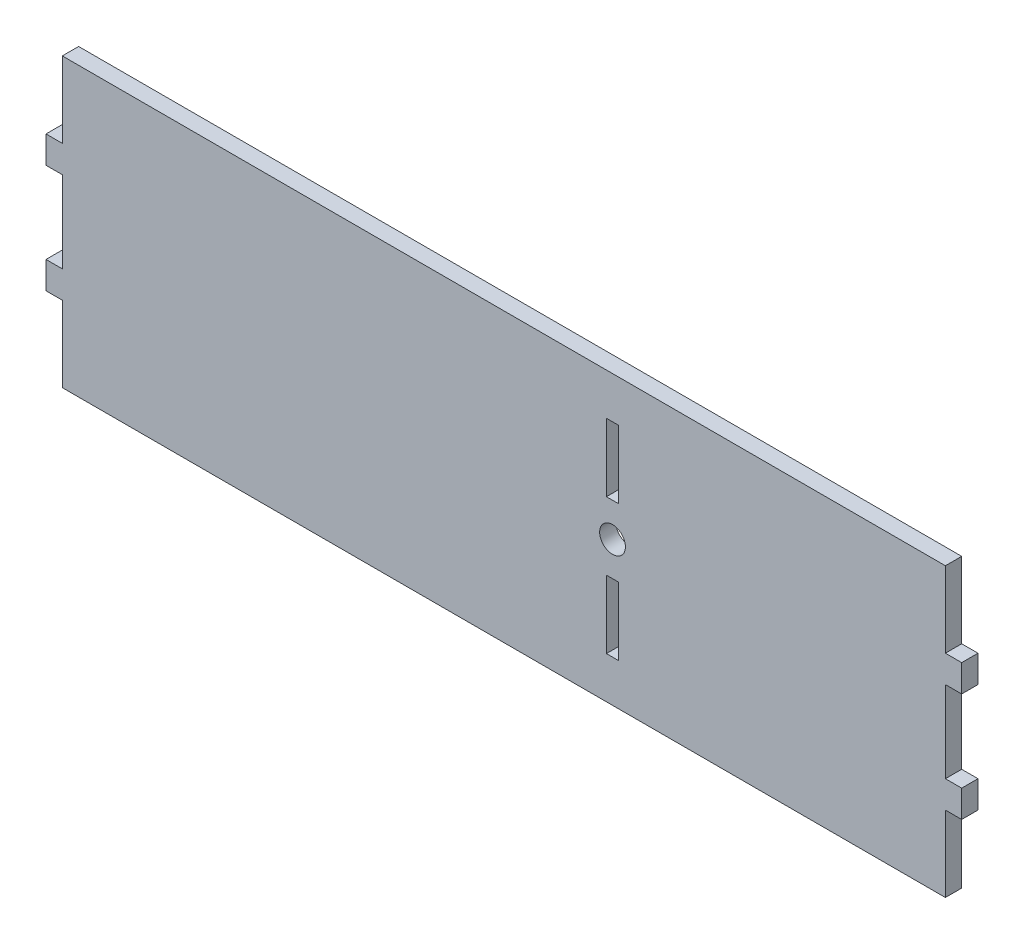
ISO-10303-21;
HEADER;
FILE_DESCRIPTION(('STEP AP214'),'2;1');
FILE_NAME('part.step','',(''),(''),'','','');
FILE_SCHEMA(('AUTOMOTIVE_DESIGN { 1 0 10303 214 1 1 1 1 }'));
ENDSEC;
DATA;
#1=APPLICATION_CONTEXT('core data for automotive mechanical design processes');
#2=APPLICATION_PROTOCOL_DEFINITION('international standard','automotive_design',2000,#1);
#3=PRODUCT_CONTEXT('',#1,'mechanical');
#4=PRODUCT('Part','Part','',(#3));
#5=PRODUCT_RELATED_PRODUCT_CATEGORY('part','',(#4));
#6=PRODUCT_DEFINITION_FORMATION('','',#4);
#7=PRODUCT_DEFINITION_CONTEXT('part definition',#1,'design');
#8=PRODUCT_DEFINITION('design','',#6,#7);
#9=PRODUCT_DEFINITION_SHAPE('','',#8);
#10=(LENGTH_UNIT() NAMED_UNIT(*) SI_UNIT(.MILLI.,.METRE.));
#11=(NAMED_UNIT(*) PLANE_ANGLE_UNIT() SI_UNIT($,.RADIAN.));
#12=(NAMED_UNIT(*) SI_UNIT($,.STERADIAN.) SOLID_ANGLE_UNIT());
#13=UNCERTAINTY_MEASURE_WITH_UNIT(LENGTH_MEASURE(1.E-05),#10,'distance_accuracy_value','');
#14=(GEOMETRIC_REPRESENTATION_CONTEXT(3) GLOBAL_UNCERTAINTY_ASSIGNED_CONTEXT((#13)) GLOBAL_UNIT_ASSIGNED_CONTEXT((#10,
#11,#12)) REPRESENTATION_CONTEXT('',''));
#15=CARTESIAN_POINT('',(0.,0.,0.));
#16=DIRECTION('',(0.,0.,1.));
#17=DIRECTION('',(1.,0.,0.));
#18=AXIS2_PLACEMENT_3D('',#15,#16,#17);
#19=CARTESIAN_POINT('',(0.,-15.,2.4));
#20=DIRECTION('',(0.,-1.,0.));
#21=DIRECTION('',(0.,0.,-1.));
#22=AXIS2_PLACEMENT_3D('',#19,#20,#21);
#23=PLANE('',#22);
#24=DIRECTION('',(-1.,0.,0.));
#25=VECTOR('',#24,1.);
#26=CARTESIAN_POINT('',(0.,-15.,0.));
#27=LINE('',#26,#25);
#28=CARTESIAN_POINT('',(16.9,-15.,0.));
#29=VERTEX_POINT('',#28);
#30=CARTESIAN_POINT('',(15.1,-15.,0.));
#31=VERTEX_POINT('',#30);
#32=EDGE_CURVE('E315',#29,#31,#27,.T.);
#33=ORIENTED_EDGE('',*,*,#32,.T.);
#34=DIRECTION('',(0.,0.,-1.));
#35=VECTOR('',#34,1.);
#36=CARTESIAN_POINT('',(15.1,-15.,2.4));
#37=LINE('',#36,#35);
#38=CARTESIAN_POINT('',(15.1,-15.,2.4));
#39=VERTEX_POINT('',#38);
#40=EDGE_CURVE('E11',#39,#31,#37,.T.);
#41=ORIENTED_EDGE('',*,*,#40,.F.);
#42=DIRECTION('',(-1.,0.,0.));
#43=VECTOR('',#42,1.);
#44=CARTESIAN_POINT('',(0.,-15.,2.4));
#45=LINE('',#44,#43);
#46=CARTESIAN_POINT('',(16.9,-15.,2.4));
#47=VERTEX_POINT('',#46);
#48=EDGE_CURVE('E234',#47,#39,#45,.T.);
#49=ORIENTED_EDGE('',*,*,#48,.F.);
#50=DIRECTION('',(0.,0.,-1.));
#51=VECTOR('',#50,1.);
#52=CARTESIAN_POINT('',(16.9,-15.,2.4));
#53=LINE('',#52,#51);
#54=EDGE_CURVE('E54',#47,#29,#53,.T.);
#55=ORIENTED_EDGE('',*,*,#54,.T.);
#56=EDGE_LOOP('',(#33,#41,#49,#55));
#57=FACE_BOUND('',#56,.T.);
#58=ADVANCED_FACE('F35',(#57),#23,.F.);
#59=CARTESIAN_POINT('',(15.1,0.,2.4));
#60=DIRECTION('',(-1.,0.,0.));
#61=DIRECTION('',(0.,-1.,0.));
#62=AXIS2_PLACEMENT_3D('',#59,#60,#61);
#63=PLANE('',#62);
#64=DIRECTION('',(0.,1.,0.));
#65=VECTOR('',#64,1.);
#66=CARTESIAN_POINT('',(15.1,0.,0.));
#67=LINE('',#66,#65);
#68=CARTESIAN_POINT('',(15.1,-5.,0.));
#69=VERTEX_POINT('',#68);
#70=EDGE_CURVE('E240',#31,#69,#67,.T.);
#71=ORIENTED_EDGE('',*,*,#70,.T.);
#72=DIRECTION('',(0.,0.,-1.));
#73=VECTOR('',#72,1.);
#74=CARTESIAN_POINT('',(15.1,-5.,2.4));
#75=LINE('',#74,#73);
#76=CARTESIAN_POINT('',(15.1,-5.,2.4));
#77=VERTEX_POINT('',#76);
#78=EDGE_CURVE('E45',#77,#69,#75,.T.);
#79=ORIENTED_EDGE('',*,*,#78,.F.);
#80=DIRECTION('',(0.,1.,0.));
#81=VECTOR('',#80,1.);
#82=CARTESIAN_POINT('',(15.1,0.,2.4));
#83=LINE('',#82,#81);
#84=EDGE_CURVE('E228',#39,#77,#83,.T.);
#85=ORIENTED_EDGE('',*,*,#84,.F.);
#86=ORIENTED_EDGE('',*,*,#40,.T.);
#87=EDGE_LOOP('',(#71,#79,#85,#86));
#88=FACE_BOUND('',#87,.T.);
#89=ADVANCED_FACE('F239',(#88),#63,.F.);
#90=CARTESIAN_POINT('',(0.,-5.,2.4));
#91=DIRECTION('',(0.,-1.,0.));
#92=DIRECTION('',(0.,0.,-1.));
#93=AXIS2_PLACEMENT_3D('',#90,#91,#92);
#94=PLANE('',#93);
#95=DIRECTION('',(-1.,0.,0.));
#96=VECTOR('',#95,1.);
#97=CARTESIAN_POINT('',(0.,-5.,0.));
#98=LINE('',#97,#96);
#99=CARTESIAN_POINT('',(16.9,-5.,0.));
#100=VERTEX_POINT('',#99);
#101=EDGE_CURVE('E318',#100,#69,#98,.T.);
#102=ORIENTED_EDGE('',*,*,#101,.F.);
#103=DIRECTION('',(0.,0.,-1.));
#104=VECTOR('',#103,1.);
#105=CARTESIAN_POINT('',(16.9,-5.,2.4));
#106=LINE('',#105,#104);
#107=CARTESIAN_POINT('',(16.9,-5.,2.4));
#108=VERTEX_POINT('',#107);
#109=EDGE_CURVE('E140',#108,#100,#106,.T.);
#110=ORIENTED_EDGE('',*,*,#109,.F.);
#111=DIRECTION('',(-1.,0.,0.));
#112=VECTOR('',#111,1.);
#113=CARTESIAN_POINT('',(0.,-5.,2.4));
#114=LINE('',#113,#112);
#115=EDGE_CURVE('E233',#108,#77,#114,.T.);
#116=ORIENTED_EDGE('',*,*,#115,.T.);
#117=ORIENTED_EDGE('',*,*,#78,.T.);
#118=EDGE_LOOP('',(#102,#110,#116,#117));
#119=FACE_BOUND('',#118,.T.);
#120=ADVANCED_FACE('F244',(#119),#94,.T.);
#121=CARTESIAN_POINT('',(16.9,0.,2.4));
#122=DIRECTION('',(1.,0.,0.));
#123=DIRECTION('',(0.,0.,-1.));
#124=AXIS2_PLACEMENT_3D('',#121,#122,#123);
#125=PLANE('',#124);
#126=DIRECTION('',(0.,-1.,0.));
#127=VECTOR('',#126,1.);
#128=CARTESIAN_POINT('',(16.9,0.,0.));
#129=LINE('',#128,#127);
#130=CARTESIAN_POINT('',(16.9,15.,0.));
#131=VERTEX_POINT('',#130);
#132=CARTESIAN_POINT('',(16.9,5.,0.));
#133=VERTEX_POINT('',#132);
#134=EDGE_CURVE('E303',#131,#133,#129,.T.);
#135=ORIENTED_EDGE('',*,*,#134,.T.);
#136=DIRECTION('',(0.,0.,-1.));
#137=VECTOR('',#136,1.);
#138=CARTESIAN_POINT('',(16.9,5.,2.4));
#139=LINE('',#138,#137);
#140=CARTESIAN_POINT('',(16.9,5.,2.4));
#141=VERTEX_POINT('',#140);
#142=EDGE_CURVE('E325',#141,#133,#139,.T.);
#143=ORIENTED_EDGE('',*,*,#142,.F.);
#144=DIRECTION('',(0.,-1.,0.));
#145=VECTOR('',#144,1.);
#146=CARTESIAN_POINT('',(16.9,0.,2.4));
#147=LINE('',#146,#145);
#148=CARTESIAN_POINT('',(16.9,15.,2.4));
#149=VERTEX_POINT('',#148);
#150=EDGE_CURVE('E445',#149,#141,#147,.T.);
#151=ORIENTED_EDGE('',*,*,#150,.F.);
#152=DIRECTION('',(0.,0.,-1.));
#153=VECTOR('',#152,1.);
#154=CARTESIAN_POINT('',(16.9,15.,2.4));
#155=LINE('',#154,#153);
#156=EDGE_CURVE('E327',#149,#131,#155,.T.);
#157=ORIENTED_EDGE('',*,*,#156,.T.);
#158=EDGE_LOOP('',(#135,#143,#151,#157));
#159=FACE_BOUND('',#158,.T.);
#160=ADVANCED_FACE('F471',(#159),#125,.F.);
#161=CARTESIAN_POINT('',(0.,5.,2.4));
#162=DIRECTION('',(0.,-1.,0.));
#163=DIRECTION('',(0.,0.,-1.));
#164=AXIS2_PLACEMENT_3D('',#161,#162,#163);
#165=PLANE('',#164);
#166=DIRECTION('',(-1.,0.,0.));
#167=VECTOR('',#166,1.);
#168=CARTESIAN_POINT('',(0.,5.,0.));
#169=LINE('',#168,#167);
#170=CARTESIAN_POINT('',(15.1,5.,0.));
#171=VERTEX_POINT('',#170);
#172=EDGE_CURVE('E306',#133,#171,#169,.T.);
#173=ORIENTED_EDGE('',*,*,#172,.T.);
#174=DIRECTION('',(0.,0.,-1.));
#175=VECTOR('',#174,1.);
#176=CARTESIAN_POINT('',(15.1,5.,2.4));
#177=LINE('',#176,#175);
#178=CARTESIAN_POINT('',(15.1,5.,2.4));
#179=VERTEX_POINT('',#178);
#180=EDGE_CURVE('E331',#179,#171,#177,.T.);
#181=ORIENTED_EDGE('',*,*,#180,.F.);
#182=DIRECTION('',(-1.,0.,0.));
#183=VECTOR('',#182,1.);
#184=CARTESIAN_POINT('',(0.,5.,2.4));
#185=LINE('',#184,#183);
#186=EDGE_CURVE('E448',#141,#179,#185,.T.);
#187=ORIENTED_EDGE('',*,*,#186,.F.);
#188=ORIENTED_EDGE('',*,*,#142,.T.);
#189=EDGE_LOOP('',(#173,#181,#187,#188));
#190=FACE_BOUND('',#189,.T.);
#191=ADVANCED_FACE('F473',(#190),#165,.F.);
#192=CARTESIAN_POINT('',(15.1,0.,2.4));
#193=DIRECTION('',(1.,0.,0.));
#194=DIRECTION('',(0.,1.,0.));
#195=AXIS2_PLACEMENT_3D('',#192,#193,#194);
#196=PLANE('',#195);
#197=DIRECTION('',(0.,-1.,0.));
#198=VECTOR('',#197,1.);
#199=CARTESIAN_POINT('',(15.1,0.,0.));
#200=LINE('',#199,#198);
#201=CARTESIAN_POINT('',(15.1,15.,0.));
#202=VERTEX_POINT('',#201);
#203=EDGE_CURVE('E309',#202,#171,#200,.T.);
#204=ORIENTED_EDGE('',*,*,#203,.F.);
#205=DIRECTION('',(0.,0.,-1.));
#206=VECTOR('',#205,1.);
#207=CARTESIAN_POINT('',(15.1,15.,2.4));
#208=LINE('',#207,#206);
#209=CARTESIAN_POINT('',(15.1,15.,2.4));
#210=VERTEX_POINT('',#209);
#211=EDGE_CURVE('E329',#210,#202,#208,.T.);
#212=ORIENTED_EDGE('',*,*,#211,.F.);
#213=DIRECTION('',(0.,-1.,0.));
#214=VECTOR('',#213,1.);
#215=CARTESIAN_POINT('',(15.1,0.,2.4));
#216=LINE('',#215,#214);
#217=EDGE_CURVE('E450',#210,#179,#216,.T.);
#218=ORIENTED_EDGE('',*,*,#217,.T.);
#219=ORIENTED_EDGE('',*,*,#180,.T.);
#220=EDGE_LOOP('',(#204,#212,#218,#219));
#221=FACE_BOUND('',#220,.T.);
#222=ADVANCED_FACE('F466',(#221),#196,.T.);
#223=CARTESIAN_POINT('',(65.,0.,2.4));
#224=DIRECTION('',(1.,0.,0.));
#225=DIRECTION('',(0.,0.,-1.));
#226=AXIS2_PLACEMENT_3D('',#223,#224,#225);
#227=PLANE('',#226);
#228=DIRECTION('',(0.,-1.,0.));
#229=VECTOR('',#228,1.);
#230=CARTESIAN_POINT('',(65.,0.,0.));
#231=LINE('',#230,#229);
#232=CARTESIAN_POINT('',(65.,5.99999999999999,0.));
#233=VERTEX_POINT('',#232);
#234=CARTESIAN_POINT('',(65.,-6.00000000000001,0.));
#235=VERTEX_POINT('',#234);
#236=EDGE_CURVE('E251',#233,#235,#231,.T.);
#237=ORIENTED_EDGE('',*,*,#236,.F.);
#238=DIRECTION('',(0.,0.,-1.));
#239=VECTOR('',#238,1.);
#240=CARTESIAN_POINT('',(65.,5.99999999999999,2.4));
#241=LINE('',#240,#239);
#242=CARTESIAN_POINT('',(65.,5.99999999999999,2.4));
#243=VERTEX_POINT('',#242);
#244=EDGE_CURVE('E39',#243,#233,#241,.T.);
#245=ORIENTED_EDGE('',*,*,#244,.F.);
#246=DIRECTION('',(0.,-1.,0.));
#247=VECTOR('',#246,1.);
#248=CARTESIAN_POINT('',(65.,0.,2.4));
#249=LINE('',#248,#247);
#250=CARTESIAN_POINT('',(65.,-6.00000000000001,2.4));
#251=VERTEX_POINT('',#250);
#252=EDGE_CURVE('E323',#243,#251,#249,.T.);
#253=ORIENTED_EDGE('',*,*,#252,.T.);
#254=DIRECTION('',(0.,0.,-1.));
#255=VECTOR('',#254,1.);
#256=CARTESIAN_POINT('',(65.,-6.00000000000001,2.4));
#257=LINE('',#256,#255);
#258=EDGE_CURVE('E247',#251,#235,#257,.T.);
#259=ORIENTED_EDGE('',*,*,#258,.T.);
#260=EDGE_LOOP('',(#237,#245,#253,#259));
#261=FACE_BOUND('',#260,.T.);
#262=ADVANCED_FACE('F385',(#261),#227,.T.);
#263=CARTESIAN_POINT('',(0.,5.99999999999999,2.4));
#264=DIRECTION('',(0.,-1.,0.));
#265=DIRECTION('',(0.,0.,-1.));
#266=AXIS2_PLACEMENT_3D('',#263,#264,#265);
#267=PLANE('',#266);
#268=DIRECTION('',(-1.,0.,0.));
#269=VECTOR('',#268,1.);
#270=CARTESIAN_POINT('',(0.,5.99999999999999,0.));
#271=LINE('',#270,#269);
#272=CARTESIAN_POINT('',(67.4,5.99999999999999,0.));
#273=VERTEX_POINT('',#272);
#274=EDGE_CURVE('E254',#273,#233,#271,.T.);
#275=ORIENTED_EDGE('',*,*,#274,.F.);
#276=DIRECTION('',(0.,0.,-1.));
#277=VECTOR('',#276,1.);
#278=CARTESIAN_POINT('',(67.4,5.99999999999999,2.4));
#279=LINE('',#278,#277);
#280=CARTESIAN_POINT('',(67.4,5.99999999999999,2.4));
#281=VERTEX_POINT('',#280);
#282=EDGE_CURVE('E376',#281,#273,#279,.T.);
#283=ORIENTED_EDGE('',*,*,#282,.F.);
#284=DIRECTION('',(-1.,0.,0.));
#285=VECTOR('',#284,1.);
#286=CARTESIAN_POINT('',(0.,5.99999999999999,2.4));
#287=LINE('',#286,#285);
#288=EDGE_CURVE('E384',#281,#243,#287,.T.);
#289=ORIENTED_EDGE('',*,*,#288,.T.);
#290=ORIENTED_EDGE('',*,*,#244,.T.);
#291=EDGE_LOOP('',(#275,#283,#289,#290));
#292=FACE_BOUND('',#291,.T.);
#293=ADVANCED_FACE('F37',(#292),#267,.T.);
#294=CARTESIAN_POINT('',(67.4,0.,2.4));
#295=DIRECTION('',(1.,0.,0.));
#296=DIRECTION('',(0.,0.,-1.));
#297=AXIS2_PLACEMENT_3D('',#294,#295,#296);
#298=PLANE('',#297);
#299=DIRECTION('',(0.,-1.,0.));
#300=VECTOR('',#299,1.);
#301=CARTESIAN_POINT('',(67.4,0.,0.));
#302=LINE('',#301,#300);
#303=CARTESIAN_POINT('',(67.4,9.99999999999999,0.));
#304=VERTEX_POINT('',#303);
#305=EDGE_CURVE('E258',#304,#273,#302,.T.);
#306=ORIENTED_EDGE('',*,*,#305,.F.);
#307=DIRECTION('',(0.,0.,-1.));
#308=VECTOR('',#307,1.);
#309=CARTESIAN_POINT('',(67.4,9.99999999999999,2.4));
#310=LINE('',#309,#308);
#311=CARTESIAN_POINT('',(67.4,9.99999999999999,2.4));
#312=VERTEX_POINT('',#311);
#313=EDGE_CURVE('E375',#312,#304,#310,.T.);
#314=ORIENTED_EDGE('',*,*,#313,.F.);
#315=DIRECTION('',(0.,-1.,0.));
#316=VECTOR('',#315,1.);
#317=CARTESIAN_POINT('',(67.4,0.,2.4));
#318=LINE('',#317,#316);
#319=EDGE_CURVE('E394',#312,#281,#318,.T.);
#320=ORIENTED_EDGE('',*,*,#319,.T.);
#321=ORIENTED_EDGE('',*,*,#282,.T.);
#322=EDGE_LOOP('',(#306,#314,#320,#321));
#323=FACE_BOUND('',#322,.T.);
#324=ADVANCED_FACE('F392',(#323),#298,.T.);
#325=CARTESIAN_POINT('',(0.,9.99999999999994,2.4));
#326=DIRECTION('',(0.,1.,0.));
#327=DIRECTION('',(-1.,0.,0.));
#328=AXIS2_PLACEMENT_3D('',#325,#326,#327);
#329=PLANE('',#328);
#330=DIRECTION('',(1.,0.,0.));
#331=VECTOR('',#330,1.);
#332=CARTESIAN_POINT('',(0.,9.99999999999994,0.));
#333=LINE('',#332,#331);
#334=CARTESIAN_POINT('',(65.,9.99999999999999,0.));
#335=VERTEX_POINT('',#334);
#336=EDGE_CURVE('E261',#335,#304,#333,.T.);
#337=ORIENTED_EDGE('',*,*,#336,.F.);
#338=DIRECTION('',(0.,0.,-1.));
#339=VECTOR('',#338,1.);
#340=CARTESIAN_POINT('',(65.,9.99999999999999,2.4));
#341=LINE('',#340,#339);
#342=CARTESIAN_POINT('',(65.,9.99999999999999,2.4));
#343=VERTEX_POINT('',#342);
#344=EDGE_CURVE('E373',#343,#335,#341,.T.);
#345=ORIENTED_EDGE('',*,*,#344,.F.);
#346=DIRECTION('',(1.,0.,0.));
#347=VECTOR('',#346,1.);
#348=CARTESIAN_POINT('',(0.,9.99999999999994,2.4));
#349=LINE('',#348,#347);
#350=EDGE_CURVE('E401',#343,#312,#349,.T.);
#351=ORIENTED_EDGE('',*,*,#350,.T.);
#352=ORIENTED_EDGE('',*,*,#313,.T.);
#353=EDGE_LOOP('',(#337,#345,#351,#352));
#354=FACE_BOUND('',#353,.T.);
#355=ADVANCED_FACE('F404',(#354),#329,.T.);
#356=CARTESIAN_POINT('',(65.,0.,2.4));
#357=DIRECTION('',(1.,0.,0.));
#358=DIRECTION('',(0.,0.,-1.));
#359=AXIS2_PLACEMENT_3D('',#356,#357,#358);
#360=PLANE('',#359);
#361=DIRECTION('',(0.,-1.,0.));
#362=VECTOR('',#361,1.);
#363=CARTESIAN_POINT('',(65.,0.,0.));
#364=LINE('',#363,#362);
#365=CARTESIAN_POINT('',(65.,21.15,0.));
#366=VERTEX_POINT('',#365);
#367=EDGE_CURVE('E264',#366,#335,#364,.T.);
#368=ORIENTED_EDGE('',*,*,#367,.F.);
#369=DIRECTION('',(0.,0.,-1.));
#370=VECTOR('',#369,1.);
#371=CARTESIAN_POINT('',(65.,21.15,2.4));
#372=LINE('',#371,#370);
#373=CARTESIAN_POINT('',(65.,21.15,2.4));
#374=VERTEX_POINT('',#373);
#375=EDGE_CURVE('E371',#374,#366,#372,.T.);
#376=ORIENTED_EDGE('',*,*,#375,.F.);
#377=DIRECTION('',(0.,-1.,0.));
#378=VECTOR('',#377,1.);
#379=CARTESIAN_POINT('',(65.,0.,2.4));
#380=LINE('',#379,#378);
#381=EDGE_CURVE('E405',#374,#343,#380,.T.);
#382=ORIENTED_EDGE('',*,*,#381,.T.);
#383=ORIENTED_EDGE('',*,*,#344,.T.);
#384=EDGE_LOOP('',(#368,#376,#382,#383));
#385=FACE_BOUND('',#384,.T.);
#386=ADVANCED_FACE('F554',(#385),#360,.T.);
#387=CARTESIAN_POINT('',(0.,21.15,2.4));
#388=DIRECTION('',(0.,-1.,0.));
#389=DIRECTION('',(1.,0.,0.));
#390=AXIS2_PLACEMENT_3D('',#387,#388,#389);
#391=PLANE('',#390);
#392=DIRECTION('',(-1.,0.,0.));
#393=VECTOR('',#392,1.);
#394=CARTESIAN_POINT('',(0.,21.15,0.));
#395=LINE('',#394,#393);
#396=CARTESIAN_POINT('',(-65.,21.15,0.));
#397=VERTEX_POINT('',#396);
#398=EDGE_CURVE('E267',#366,#397,#395,.T.);
#399=ORIENTED_EDGE('',*,*,#398,.T.);
#400=DIRECTION('',(0.,0.,-1.));
#401=VECTOR('',#400,1.);
#402=CARTESIAN_POINT('',(-65.,21.15,2.4));
#403=LINE('',#402,#401);
#404=CARTESIAN_POINT('',(-65.,21.15,2.4));
#405=VERTEX_POINT('',#404);
#406=EDGE_CURVE('E368',#405,#397,#403,.T.);
#407=ORIENTED_EDGE('',*,*,#406,.F.);
#408=DIRECTION('',(-1.,0.,0.));
#409=VECTOR('',#408,1.);
#410=CARTESIAN_POINT('',(0.,21.15,2.4));
#411=LINE('',#410,#409);
#412=EDGE_CURVE('E407',#374,#405,#411,.T.);
#413=ORIENTED_EDGE('',*,*,#412,.F.);
#414=ORIENTED_EDGE('',*,*,#375,.T.);
#415=EDGE_LOOP('',(#399,#407,#413,#414));
#416=FACE_BOUND('',#415,.T.);
#417=ADVANCED_FACE('F551',(#416),#391,.F.);
#418=CARTESIAN_POINT('',(-65.,0.,2.4));
#419=DIRECTION('',(1.,0.,0.));
#420=DIRECTION('',(0.,0.,-1.));
#421=AXIS2_PLACEMENT_3D('',#418,#419,#420);
#422=PLANE('',#421);
#423=DIRECTION('',(0.,-1.,0.));
#424=VECTOR('',#423,1.);
#425=CARTESIAN_POINT('',(-65.,0.,0.));
#426=LINE('',#425,#424);
#427=CARTESIAN_POINT('',(-65.,9.99999999999999,0.));
#428=VERTEX_POINT('',#427);
#429=EDGE_CURVE('E269',#397,#428,#426,.T.);
#430=ORIENTED_EDGE('',*,*,#429,.T.);
#431=DIRECTION('',(0.,0.,-1.));
#432=VECTOR('',#431,1.);
#433=CARTESIAN_POINT('',(-65.,9.99999999999999,2.4));
#434=LINE('',#433,#432);
#435=CARTESIAN_POINT('',(-65.,9.99999999999999,2.4));
#436=VERTEX_POINT('',#435);
#437=EDGE_CURVE('E365',#436,#428,#434,.T.);
#438=ORIENTED_EDGE('',*,*,#437,.F.);
#439=DIRECTION('',(0.,-1.,0.));
#440=VECTOR('',#439,1.);
#441=CARTESIAN_POINT('',(-65.,0.,2.4));
#442=LINE('',#441,#440);
#443=EDGE_CURVE('E412',#405,#436,#442,.T.);
#444=ORIENTED_EDGE('',*,*,#443,.F.);
#445=ORIENTED_EDGE('',*,*,#406,.T.);
#446=EDGE_LOOP('',(#430,#438,#444,#445));
#447=FACE_BOUND('',#446,.T.);
#448=ADVANCED_FACE('F539',(#447),#422,.F.);
#449=CARTESIAN_POINT('',(0.,9.99999999999994,2.4));
#450=DIRECTION('',(0.,-1.,0.));
#451=DIRECTION('',(1.,0.,0.));
#452=AXIS2_PLACEMENT_3D('',#449,#450,#451);
#453=PLANE('',#452);
#454=DIRECTION('',(-1.,0.,0.));
#455=VECTOR('',#454,1.);
#456=CARTESIAN_POINT('',(0.,9.99999999999994,0.));
#457=LINE('',#456,#455);
#458=CARTESIAN_POINT('',(-67.4,9.99999999999999,0.));
#459=VERTEX_POINT('',#458);
#460=EDGE_CURVE('E271',#428,#459,#457,.T.);
#461=ORIENTED_EDGE('',*,*,#460,.T.);
#462=DIRECTION('',(0.,0.,-1.));
#463=VECTOR('',#462,1.);
#464=CARTESIAN_POINT('',(-67.4,9.99999999999999,2.4));
#465=LINE('',#464,#463);
#466=CARTESIAN_POINT('',(-67.4,9.99999999999999,2.4));
#467=VERTEX_POINT('',#466);
#468=EDGE_CURVE('E362',#467,#459,#465,.T.);
#469=ORIENTED_EDGE('',*,*,#468,.F.);
#470=DIRECTION('',(-1.,0.,0.));
#471=VECTOR('',#470,1.);
#472=CARTESIAN_POINT('',(0.,9.99999999999994,2.4));
#473=LINE('',#472,#471);
#474=EDGE_CURVE('E414',#436,#467,#473,.T.);
#475=ORIENTED_EDGE('',*,*,#474,.F.);
#476=ORIENTED_EDGE('',*,*,#437,.T.);
#477=EDGE_LOOP('',(#461,#469,#475,#476));
#478=FACE_BOUND('',#477,.T.);
#479=ADVANCED_FACE('F546',(#478),#453,.F.);
#480=CARTESIAN_POINT('',(-67.4,0.,2.4));
#481=DIRECTION('',(1.,0.,0.));
#482=DIRECTION('',(0.,0.,-1.));
#483=AXIS2_PLACEMENT_3D('',#480,#481,#482);
#484=PLANE('',#483);
#485=DIRECTION('',(0.,-1.,0.));
#486=VECTOR('',#485,1.);
#487=CARTESIAN_POINT('',(-67.4,0.,0.));
#488=LINE('',#487,#486);
#489=CARTESIAN_POINT('',(-67.4,5.99999999999999,0.));
#490=VERTEX_POINT('',#489);
#491=EDGE_CURVE('E274',#459,#490,#488,.T.);
#492=ORIENTED_EDGE('',*,*,#491,.T.);
#493=DIRECTION('',(0.,0.,-1.));
#494=VECTOR('',#493,1.);
#495=CARTESIAN_POINT('',(-67.4,5.99999999999999,2.4));
#496=LINE('',#495,#494);
#497=CARTESIAN_POINT('',(-67.4,5.99999999999999,2.4));
#498=VERTEX_POINT('',#497);
#499=EDGE_CURVE('E359',#498,#490,#496,.T.);
#500=ORIENTED_EDGE('',*,*,#499,.F.);
#501=DIRECTION('',(0.,-1.,0.));
#502=VECTOR('',#501,1.);
#503=CARTESIAN_POINT('',(-67.4,0.,2.4));
#504=LINE('',#503,#502);
#505=EDGE_CURVE('E417',#467,#498,#504,.T.);
#506=ORIENTED_EDGE('',*,*,#505,.F.);
#507=ORIENTED_EDGE('',*,*,#468,.T.);
#508=EDGE_LOOP('',(#492,#500,#506,#507));
#509=FACE_BOUND('',#508,.T.);
#510=ADVANCED_FACE('F542',(#509),#484,.F.);
#511=CARTESIAN_POINT('',(0.,5.99999999999999,2.4));
#512=DIRECTION('',(0.,1.,0.));
#513=DIRECTION('',(0.,0.,1.));
#514=AXIS2_PLACEMENT_3D('',#511,#512,#513);
#515=PLANE('',#514);
#516=DIRECTION('',(1.,0.,0.));
#517=VECTOR('',#516,1.);
#518=CARTESIAN_POINT('',(0.,5.99999999999999,0.));
#519=LINE('',#518,#517);
#520=CARTESIAN_POINT('',(-65.,5.99999999999999,0.));
#521=VERTEX_POINT('',#520);
#522=EDGE_CURVE('E276',#490,#521,#519,.T.);
#523=ORIENTED_EDGE('',*,*,#522,.T.);
#524=DIRECTION('',(0.,0.,-1.));
#525=VECTOR('',#524,1.);
#526=CARTESIAN_POINT('',(-65.,5.99999999999999,2.4));
#527=LINE('',#526,#525);
#528=CARTESIAN_POINT('',(-65.,5.99999999999999,2.4));
#529=VERTEX_POINT('',#528);
#530=EDGE_CURVE('E356',#529,#521,#527,.T.);
#531=ORIENTED_EDGE('',*,*,#530,.F.);
#532=DIRECTION('',(1.,0.,0.));
#533=VECTOR('',#532,1.);
#534=CARTESIAN_POINT('',(0.,5.99999999999999,2.4));
#535=LINE('',#534,#533);
#536=EDGE_CURVE('E419',#498,#529,#535,.T.);
#537=ORIENTED_EDGE('',*,*,#536,.F.);
#538=ORIENTED_EDGE('',*,*,#499,.T.);
#539=EDGE_LOOP('',(#523,#531,#537,#538));
#540=FACE_BOUND('',#539,.T.);
#541=ADVANCED_FACE('F537',(#540),#515,.F.);
#542=CARTESIAN_POINT('',(-65.,-6.00000000000001,0.));
#543=VERTEX_POINT('',#542);
#544=EDGE_CURVE('E272',#521,#543,#426,.T.);
#545=ORIENTED_EDGE('',*,*,#544,.T.);
#546=DIRECTION('',(0.,0.,-1.));
#547=VECTOR('',#546,1.);
#548=CARTESIAN_POINT('',(-65.,-6.00000000000001,2.4));
#549=LINE('',#548,#547);
#550=CARTESIAN_POINT('',(-65.,-6.00000000000001,2.4));
#551=VERTEX_POINT('',#550);
#552=EDGE_CURVE('E354',#551,#543,#549,.T.);
#553=ORIENTED_EDGE('',*,*,#552,.F.);
#554=EDGE_CURVE('E415',#529,#551,#442,.T.);
#555=ORIENTED_EDGE('',*,*,#554,.F.);
#556=ORIENTED_EDGE('',*,*,#530,.T.);
#557=EDGE_LOOP('',(#545,#553,#555,#556));
#558=FACE_BOUND('',#557,.T.);
#559=ADVANCED_FACE('F533',(#558),#422,.F.);
#560=CARTESIAN_POINT('',(0.,-6.00000000000001,2.4));
#561=DIRECTION('',(0.,1.,0.));
#562=DIRECTION('',(0.,0.,1.));
#563=AXIS2_PLACEMENT_3D('',#560,#561,#562);
#564=PLANE('',#563);
#565=DIRECTION('',(1.,0.,0.));
#566=VECTOR('',#565,1.);
#567=CARTESIAN_POINT('',(0.,-6.00000000000001,0.));
#568=LINE('',#567,#566);
#569=CARTESIAN_POINT('',(-67.4,-6.00000000000001,0.));
#570=VERTEX_POINT('',#569);
#571=EDGE_CURVE('E278',#570,#543,#568,.T.);
#572=ORIENTED_EDGE('',*,*,#571,.F.);
#573=DIRECTION('',(0.,0.,-1.));
#574=VECTOR('',#573,1.);
#575=CARTESIAN_POINT('',(-67.4,-6.00000000000001,2.4));
#576=LINE('',#575,#574);
#577=CARTESIAN_POINT('',(-67.4,-6.00000000000001,2.4));
#578=VERTEX_POINT('',#577);
#579=EDGE_CURVE('E352',#578,#570,#576,.T.);
#580=ORIENTED_EDGE('',*,*,#579,.F.);
#581=DIRECTION('',(1.,0.,0.));
#582=VECTOR('',#581,1.);
#583=CARTESIAN_POINT('',(0.,-6.00000000000001,2.4));
#584=LINE('',#583,#582);
#585=EDGE_CURVE('E421',#578,#551,#584,.T.);
#586=ORIENTED_EDGE('',*,*,#585,.T.);
#587=ORIENTED_EDGE('',*,*,#552,.T.);
#588=EDGE_LOOP('',(#572,#580,#586,#587));
#589=FACE_BOUND('',#588,.T.);
#590=ADVANCED_FACE('F529',(#589),#564,.T.);
#591=CARTESIAN_POINT('',(-67.4,0.,2.4));
#592=DIRECTION('',(-1.,0.,0.));
#593=DIRECTION('',(0.,0.,1.));
#594=AXIS2_PLACEMENT_3D('',#591,#592,#593);
#595=PLANE('',#594);
#596=DIRECTION('',(0.,1.,0.));
#597=VECTOR('',#596,1.);
#598=CARTESIAN_POINT('',(-67.4,0.,0.));
#599=LINE('',#598,#597);
#600=CARTESIAN_POINT('',(-67.4,-10.,0.));
#601=VERTEX_POINT('',#600);
#602=EDGE_CURVE('E281',#601,#570,#599,.T.);
#603=ORIENTED_EDGE('',*,*,#602,.F.);
#604=DIRECTION('',(0.,0.,-1.));
#605=VECTOR('',#604,1.);
#606=CARTESIAN_POINT('',(-67.4,-10.,2.4));
#607=LINE('',#606,#605);
#608=CARTESIAN_POINT('',(-67.4,-10.,2.4));
#609=VERTEX_POINT('',#608);
#610=EDGE_CURVE('E350',#609,#601,#607,.T.);
#611=ORIENTED_EDGE('',*,*,#610,.F.);
#612=DIRECTION('',(0.,1.,0.));
#613=VECTOR('',#612,1.);
#614=CARTESIAN_POINT('',(-67.4,0.,2.4));
#615=LINE('',#614,#613);
#616=EDGE_CURVE('E424',#609,#578,#615,.T.);
#617=ORIENTED_EDGE('',*,*,#616,.T.);
#618=ORIENTED_EDGE('',*,*,#579,.T.);
#619=EDGE_LOOP('',(#603,#611,#617,#618));
#620=FACE_BOUND('',#619,.T.);
#621=ADVANCED_FACE('F525',(#620),#595,.T.);
#622=CARTESIAN_POINT('',(0.,-9.99999999999996,2.4));
#623=DIRECTION('',(0.,-1.,0.));
#624=DIRECTION('',(1.,0.,0.));
#625=AXIS2_PLACEMENT_3D('',#622,#623,#624);
#626=PLANE('',#625);
#627=DIRECTION('',(-1.,0.,0.));
#628=VECTOR('',#627,1.);
#629=CARTESIAN_POINT('',(0.,-9.99999999999996,0.));
#630=LINE('',#629,#628);
#631=CARTESIAN_POINT('',(-65.,-10.,0.));
#632=VERTEX_POINT('',#631);
#633=EDGE_CURVE('E284',#632,#601,#630,.T.);
#634=ORIENTED_EDGE('',*,*,#633,.F.);
#635=DIRECTION('',(0.,0.,-1.));
#636=VECTOR('',#635,1.);
#637=CARTESIAN_POINT('',(-65.,-10.,2.4));
#638=LINE('',#637,#636);
#639=CARTESIAN_POINT('',(-65.,-10.,2.4));
#640=VERTEX_POINT('',#639);
#641=EDGE_CURVE('E348',#640,#632,#638,.T.);
#642=ORIENTED_EDGE('',*,*,#641,.F.);
#643=DIRECTION('',(-1.,0.,0.));
#644=VECTOR('',#643,1.);
#645=CARTESIAN_POINT('',(0.,-9.99999999999996,2.4));
#646=LINE('',#645,#644);
#647=EDGE_CURVE('E427',#640,#609,#646,.T.);
#648=ORIENTED_EDGE('',*,*,#647,.T.);
#649=ORIENTED_EDGE('',*,*,#610,.T.);
#650=EDGE_LOOP('',(#634,#642,#648,#649));
#651=FACE_BOUND('',#650,.T.);
#652=ADVANCED_FACE('F521',(#651),#626,.T.);
#653=CARTESIAN_POINT('',(-65.,0.,2.4));
#654=DIRECTION('',(1.,0.,0.));
#655=DIRECTION('',(0.,0.,-1.));
#656=AXIS2_PLACEMENT_3D('',#653,#654,#655);
#657=PLANE('',#656);
#658=DIRECTION('',(0.,-1.,0.));
#659=VECTOR('',#658,1.);
#660=CARTESIAN_POINT('',(-65.,0.,0.));
#661=LINE('',#660,#659);
#662=CARTESIAN_POINT('',(-65.,-21.15,0.));
#663=VERTEX_POINT('',#662);
#664=EDGE_CURVE('E287',#632,#663,#661,.T.);
#665=ORIENTED_EDGE('',*,*,#664,.T.);
#666=DIRECTION('',(0.,0.,-1.));
#667=VECTOR('',#666,1.);
#668=CARTESIAN_POINT('',(-65.,-21.15,2.4));
#669=LINE('',#668,#667);
#670=CARTESIAN_POINT('',(-65.,-21.15,2.4));
#671=VERTEX_POINT('',#670);
#672=EDGE_CURVE('E346',#671,#663,#669,.T.);
#673=ORIENTED_EDGE('',*,*,#672,.F.);
#674=DIRECTION('',(0.,-1.,0.));
#675=VECTOR('',#674,1.);
#676=CARTESIAN_POINT('',(-65.,0.,2.4));
#677=LINE('',#676,#675);
#678=EDGE_CURVE('E430',#640,#671,#677,.T.);
#679=ORIENTED_EDGE('',*,*,#678,.F.);
#680=ORIENTED_EDGE('',*,*,#641,.T.);
#681=EDGE_LOOP('',(#665,#673,#679,#680));
#682=FACE_BOUND('',#681,.T.);
#683=ADVANCED_FACE('F517',(#682),#657,.F.);
#684=CARTESIAN_POINT('',(0.,-21.15,2.4));
#685=DIRECTION('',(0.,-1.,0.));
#686=DIRECTION('',(1.,0.,0.));
#687=AXIS2_PLACEMENT_3D('',#684,#685,#686);
#688=PLANE('',#687);
#689=DIRECTION('',(-1.,0.,0.));
#690=VECTOR('',#689,1.);
#691=CARTESIAN_POINT('',(0.,-21.15,0.));
#692=LINE('',#691,#690);
#693=CARTESIAN_POINT('',(65.,-21.15,0.));
#694=VERTEX_POINT('',#693);
#695=EDGE_CURVE('E290',#694,#663,#692,.T.);
#696=ORIENTED_EDGE('',*,*,#695,.F.);
#697=DIRECTION('',(0.,0.,-1.));
#698=VECTOR('',#697,1.);
#699=CARTESIAN_POINT('',(65.,-21.15,2.4));
#700=LINE('',#699,#698);
#701=CARTESIAN_POINT('',(65.,-21.15,2.4));
#702=VERTEX_POINT('',#701);
#703=EDGE_CURVE('E344',#702,#694,#700,.T.);
#704=ORIENTED_EDGE('',*,*,#703,.F.);
#705=DIRECTION('',(-1.,0.,0.));
#706=VECTOR('',#705,1.);
#707=CARTESIAN_POINT('',(0.,-21.15,2.4));
#708=LINE('',#707,#706);
#709=EDGE_CURVE('E432',#702,#671,#708,.T.);
#710=ORIENTED_EDGE('',*,*,#709,.T.);
#711=ORIENTED_EDGE('',*,*,#672,.T.);
#712=EDGE_LOOP('',(#696,#704,#710,#711));
#713=FACE_BOUND('',#712,.T.);
#714=ADVANCED_FACE('F513',(#713),#688,.T.);
#715=CARTESIAN_POINT('',(65.,-10.,0.));
#716=VERTEX_POINT('',#715);
#717=EDGE_CURVE('E255',#716,#694,#231,.T.);
#718=ORIENTED_EDGE('',*,*,#717,.F.);
#719=DIRECTION('',(0.,0.,-1.));
#720=VECTOR('',#719,1.);
#721=CARTESIAN_POINT('',(65.,-10.,2.4));
#722=LINE('',#721,#720);
#723=CARTESIAN_POINT('',(65.,-10.,2.4));
#724=VERTEX_POINT('',#723);
#725=EDGE_CURVE('E342',#724,#716,#722,.T.);
#726=ORIENTED_EDGE('',*,*,#725,.F.);
#727=EDGE_CURVE('E435',#724,#702,#249,.T.);
#728=ORIENTED_EDGE('',*,*,#727,.T.);
#729=ORIENTED_EDGE('',*,*,#703,.T.);
#730=EDGE_LOOP('',(#718,#726,#728,#729));
#731=FACE_BOUND('',#730,.T.);
#732=ADVANCED_FACE('F506',(#731),#227,.T.);
#733=CARTESIAN_POINT('',(0.,-9.99999999999996,2.4));
#734=DIRECTION('',(0.,1.,0.));
#735=DIRECTION('',(-1.,0.,0.));
#736=AXIS2_PLACEMENT_3D('',#733,#734,#735);
#737=PLANE('',#736);
#738=DIRECTION('',(1.,0.,0.));
#739=VECTOR('',#738,1.);
#740=CARTESIAN_POINT('',(0.,-9.99999999999996,0.));
#741=LINE('',#740,#739);
#742=CARTESIAN_POINT('',(67.4,-10.,0.));
#743=VERTEX_POINT('',#742);
#744=EDGE_CURVE('E293',#716,#743,#741,.T.);
#745=ORIENTED_EDGE('',*,*,#744,.T.);
#746=DIRECTION('',(0.,0.,-1.));
#747=VECTOR('',#746,1.);
#748=CARTESIAN_POINT('',(67.4,-10.,2.4));
#749=LINE('',#748,#747);
#750=CARTESIAN_POINT('',(67.4,-10.,2.4));
#751=VERTEX_POINT('',#750);
#752=EDGE_CURVE('E339',#751,#743,#749,.T.);
#753=ORIENTED_EDGE('',*,*,#752,.F.);
#754=DIRECTION('',(1.,0.,0.));
#755=VECTOR('',#754,1.);
#756=CARTESIAN_POINT('',(0.,-9.99999999999996,2.4));
#757=LINE('',#756,#755);
#758=EDGE_CURVE('E436',#724,#751,#757,.T.);
#759=ORIENTED_EDGE('',*,*,#758,.F.);
#760=ORIENTED_EDGE('',*,*,#725,.T.);
#761=EDGE_LOOP('',(#745,#753,#759,#760));
#762=FACE_BOUND('',#761,.T.);
#763=ADVANCED_FACE('F500',(#762),#737,.F.);
#764=CARTESIAN_POINT('',(67.4,0.,2.4));
#765=DIRECTION('',(-1.,0.,0.));
#766=DIRECTION('',(0.,0.,1.));
#767=AXIS2_PLACEMENT_3D('',#764,#765,#766);
#768=PLANE('',#767);
#769=DIRECTION('',(0.,1.,0.));
#770=VECTOR('',#769,1.);
#771=CARTESIAN_POINT('',(67.4,0.,0.));
#772=LINE('',#771,#770);
#773=CARTESIAN_POINT('',(67.4,-6.00000000000001,0.));
#774=VERTEX_POINT('',#773);
#775=EDGE_CURVE('E295',#743,#774,#772,.T.);
#776=ORIENTED_EDGE('',*,*,#775,.T.);
#777=DIRECTION('',(0.,0.,-1.));
#778=VECTOR('',#777,1.);
#779=CARTESIAN_POINT('',(67.4,-6.00000000000001,2.4));
#780=LINE('',#779,#778);
#781=CARTESIAN_POINT('',(67.4,-6.00000000000001,2.4));
#782=VERTEX_POINT('',#781);
#783=EDGE_CURVE('E336',#782,#774,#780,.T.);
#784=ORIENTED_EDGE('',*,*,#783,.F.);
#785=DIRECTION('',(0.,1.,0.));
#786=VECTOR('',#785,1.);
#787=CARTESIAN_POINT('',(67.4,0.,2.4));
#788=LINE('',#787,#786);
#789=EDGE_CURVE('E438',#751,#782,#788,.T.);
#790=ORIENTED_EDGE('',*,*,#789,.F.);
#791=ORIENTED_EDGE('',*,*,#752,.T.);
#792=EDGE_LOOP('',(#776,#784,#790,#791));
#793=FACE_BOUND('',#792,.T.);
#794=ADVANCED_FACE('F492',(#793),#768,.F.);
#795=CARTESIAN_POINT('',(0.,15.,2.4));
#796=DIRECTION('',(0.,-1.,0.));
#797=DIRECTION('',(0.,0.,-1.));
#798=AXIS2_PLACEMENT_3D('',#795,#796,#797);
#799=PLANE('',#798);
#800=DIRECTION('',(-1.,0.,0.));
#801=VECTOR('',#800,1.);
#802=CARTESIAN_POINT('',(0.,15.,0.));
#803=LINE('',#802,#801);
#804=EDGE_CURVE('E312',#131,#202,#803,.T.);
#805=ORIENTED_EDGE('',*,*,#804,.F.);
#806=ORIENTED_EDGE('',*,*,#156,.F.);
#807=DIRECTION('',(-1.,0.,0.));
#808=VECTOR('',#807,1.);
#809=CARTESIAN_POINT('',(0.,15.,2.4));
#810=LINE('',#809,#808);
#811=EDGE_CURVE('E453',#149,#210,#810,.T.);
#812=ORIENTED_EDGE('',*,*,#811,.T.);
#813=ORIENTED_EDGE('',*,*,#211,.T.);
#814=EDGE_LOOP('',(#805,#806,#812,#813));
#815=FACE_BOUND('',#814,.T.);
#816=ADVANCED_FACE('F458',(#815),#799,.T.);
#817=CARTESIAN_POINT('',(16.,0.,2.4));
#818=DIRECTION('',(0.,0.,-1.));
#819=DIRECTION('',(-1.,0.,0.));
#820=AXIS2_PLACEMENT_3D('',#817,#818,#819);
#821=CYLINDRICAL_SURFACE('',#820,1.9);
#822=CARTESIAN_POINT('',(16.,0.,2.4));
#823=DIRECTION('',(0.,0.,1.));
#824=DIRECTION('',(1.,0.,0.));
#825=AXIS2_PLACEMENT_3D('',#822,#823,#824);
#826=CIRCLE('',#825,1.9);
#827=CARTESIAN_POINT('',(17.9,0.,2.4));
#828=VERTEX_POINT('',#827);
#829=EDGE_CURVE('E442',#828,#828,#826,.T.);
#830=ORIENTED_EDGE('',*,*,#829,.T.);
#831=EDGE_LOOP('',(#830));
#832=FACE_BOUND('',#831,.T.);
#833=CARTESIAN_POINT('',(16.,0.,0.));
#834=DIRECTION('',(0.,0.,1.));
#835=DIRECTION('',(1.,0.,0.));
#836=AXIS2_PLACEMENT_3D('',#833,#834,#835);
#837=CIRCLE('',#836,1.9);
#838=CARTESIAN_POINT('',(17.9,0.,0.));
#839=VERTEX_POINT('',#838);
#840=EDGE_CURVE('E300',#839,#839,#837,.T.);
#841=ORIENTED_EDGE('',*,*,#840,.F.);
#842=EDGE_LOOP('',(#841));
#843=FACE_BOUND('',#842,.T.);
#844=ADVANCED_FACE('F491',(#832,#843),#821,.F.);
#845=CARTESIAN_POINT('',(0.,-6.00000000000001,2.4));
#846=DIRECTION('',(0.,-1.,0.));
#847=DIRECTION('',(0.,0.,-1.));
#848=AXIS2_PLACEMENT_3D('',#845,#846,#847);
#849=PLANE('',#848);
#850=DIRECTION('',(-1.,0.,0.));
#851=VECTOR('',#850,1.);
#852=CARTESIAN_POINT('',(0.,-6.00000000000001,0.));
#853=LINE('',#852,#851);
#854=EDGE_CURVE('E297',#774,#235,#853,.T.);
#855=ORIENTED_EDGE('',*,*,#854,.T.);
#856=ORIENTED_EDGE('',*,*,#258,.F.);
#857=DIRECTION('',(-1.,0.,0.));
#858=VECTOR('',#857,1.);
#859=CARTESIAN_POINT('',(0.,-6.00000000000001,2.4));
#860=LINE('',#859,#858);
#861=EDGE_CURVE('E440',#782,#251,#860,.T.);
#862=ORIENTED_EDGE('',*,*,#861,.F.);
#863=ORIENTED_EDGE('',*,*,#783,.T.);
#864=EDGE_LOOP('',(#855,#856,#862,#863));
#865=FACE_BOUND('',#864,.T.);
#866=ADVANCED_FACE('F497',(#865),#849,.F.);
#867=CARTESIAN_POINT('',(16.9,0.,2.4));
#868=DIRECTION('',(-1.,0.,0.));
#869=DIRECTION('',(0.,0.,1.));
#870=AXIS2_PLACEMENT_3D('',#867,#868,#869);
#871=PLANE('',#870);
#872=DIRECTION('',(0.,1.,0.));
#873=VECTOR('',#872,1.);
#874=CARTESIAN_POINT('',(16.9,0.,0.));
#875=LINE('',#874,#873);
#876=EDGE_CURVE('E320',#29,#100,#875,.T.);
#877=ORIENTED_EDGE('',*,*,#876,.F.);
#878=ORIENTED_EDGE('',*,*,#54,.F.);
#879=DIRECTION('',(0.,1.,0.));
#880=VECTOR('',#879,1.);
#881=CARTESIAN_POINT('',(16.9,0.,2.4));
#882=LINE('',#881,#880);
#883=EDGE_CURVE('E245',#47,#108,#882,.T.);
#884=ORIENTED_EDGE('',*,*,#883,.T.);
#885=ORIENTED_EDGE('',*,*,#109,.T.);
#886=EDGE_LOOP('',(#877,#878,#884,#885));
#887=FACE_BOUND('',#886,.T.);
#888=ADVANCED_FACE('F605',(#887),#871,.T.);
#889=CARTESIAN_POINT('',(0.,0.,2.4));
#890=DIRECTION('',(0.,0.,1.));
#891=DIRECTION('',(1.,0.,0.));
#892=AXIS2_PLACEMENT_3D('',#889,#890,#891);
#893=PLANE('',#892);
#894=ORIENTED_EDGE('',*,*,#252,.F.);
#895=ORIENTED_EDGE('',*,*,#288,.F.);
#896=ORIENTED_EDGE('',*,*,#319,.F.);
#897=ORIENTED_EDGE('',*,*,#350,.F.);
#898=ORIENTED_EDGE('',*,*,#381,.F.);
#899=ORIENTED_EDGE('',*,*,#412,.T.);
#900=ORIENTED_EDGE('',*,*,#443,.T.);
#901=ORIENTED_EDGE('',*,*,#474,.T.);
#902=ORIENTED_EDGE('',*,*,#505,.T.);
#903=ORIENTED_EDGE('',*,*,#536,.T.);
#904=ORIENTED_EDGE('',*,*,#554,.T.);
#905=ORIENTED_EDGE('',*,*,#585,.F.);
#906=ORIENTED_EDGE('',*,*,#616,.F.);
#907=ORIENTED_EDGE('',*,*,#647,.F.);
#908=ORIENTED_EDGE('',*,*,#678,.T.);
#909=ORIENTED_EDGE('',*,*,#709,.F.);
#910=ORIENTED_EDGE('',*,*,#727,.F.);
#911=ORIENTED_EDGE('',*,*,#758,.T.);
#912=ORIENTED_EDGE('',*,*,#789,.T.);
#913=ORIENTED_EDGE('',*,*,#861,.T.);
#914=EDGE_LOOP('',(#894,#895,#896,#897,#898,#899,#900,#901,#902,#903,#904,#905,#906,#907,#908,
#909,#910,#911,#912,#913));
#915=FACE_BOUND('',#914,.T.);
#916=ORIENTED_EDGE('',*,*,#829,.F.);
#917=EDGE_LOOP('',(#916));
#918=FACE_BOUND('',#917,.T.);
#919=ORIENTED_EDGE('',*,*,#150,.T.);
#920=ORIENTED_EDGE('',*,*,#186,.T.);
#921=ORIENTED_EDGE('',*,*,#217,.F.);
#922=ORIENTED_EDGE('',*,*,#811,.F.);
#923=EDGE_LOOP('',(#919,#920,#921,#922));
#924=FACE_BOUND('',#923,.T.);
#925=ORIENTED_EDGE('',*,*,#48,.T.);
#926=ORIENTED_EDGE('',*,*,#84,.T.);
#927=ORIENTED_EDGE('',*,*,#115,.F.);
#928=ORIENTED_EDGE('',*,*,#883,.F.);
#929=EDGE_LOOP('',(#925,#926,#927,#928));
#930=FACE_BOUND('',#929,.T.);
#931=ADVANCED_FACE('F230',(#915,#918,#924,#930),#893,.T.);
#932=CARTESIAN_POINT('',(0.,0.,0.));
#933=DIRECTION('',(0.,0.,1.));
#934=DIRECTION('',(1.,0.,0.));
#935=AXIS2_PLACEMENT_3D('',#932,#933,#934);
#936=PLANE('',#935);
#937=ORIENTED_EDGE('',*,*,#236,.T.);
#938=ORIENTED_EDGE('',*,*,#854,.F.);
#939=ORIENTED_EDGE('',*,*,#775,.F.);
#940=ORIENTED_EDGE('',*,*,#744,.F.);
#941=ORIENTED_EDGE('',*,*,#717,.T.);
#942=ORIENTED_EDGE('',*,*,#695,.T.);
#943=ORIENTED_EDGE('',*,*,#664,.F.);
#944=ORIENTED_EDGE('',*,*,#633,.T.);
#945=ORIENTED_EDGE('',*,*,#602,.T.);
#946=ORIENTED_EDGE('',*,*,#571,.T.);
#947=ORIENTED_EDGE('',*,*,#544,.F.);
#948=ORIENTED_EDGE('',*,*,#522,.F.);
#949=ORIENTED_EDGE('',*,*,#491,.F.);
#950=ORIENTED_EDGE('',*,*,#460,.F.);
#951=ORIENTED_EDGE('',*,*,#429,.F.);
#952=ORIENTED_EDGE('',*,*,#398,.F.);
#953=ORIENTED_EDGE('',*,*,#367,.T.);
#954=ORIENTED_EDGE('',*,*,#336,.T.);
#955=ORIENTED_EDGE('',*,*,#305,.T.);
#956=ORIENTED_EDGE('',*,*,#274,.T.);
#957=EDGE_LOOP('',(#937,#938,#939,#940,#941,#942,#943,#944,#945,#946,#947,#948,#949,#950,#951,
#952,#953,#954,#955,#956));
#958=FACE_BOUND('',#957,.T.);
#959=ORIENTED_EDGE('',*,*,#840,.T.);
#960=EDGE_LOOP('',(#959));
#961=FACE_BOUND('',#960,.T.);
#962=ORIENTED_EDGE('',*,*,#134,.F.);
#963=ORIENTED_EDGE('',*,*,#804,.T.);
#964=ORIENTED_EDGE('',*,*,#203,.T.);
#965=ORIENTED_EDGE('',*,*,#172,.F.);
#966=EDGE_LOOP('',(#962,#963,#964,#965));
#967=FACE_BOUND('',#966,.T.);
#968=ORIENTED_EDGE('',*,*,#32,.F.);
#969=ORIENTED_EDGE('',*,*,#876,.T.);
#970=ORIENTED_EDGE('',*,*,#101,.T.);
#971=ORIENTED_EDGE('',*,*,#70,.F.);
#972=EDGE_LOOP('',(#968,#969,#970,#971));
#973=FACE_BOUND('',#972,.T.);
#974=ADVANCED_FACE('F389',(#958,#961,#967,#973),#936,.F.);
#975=CLOSED_SHELL('',(#58,#89,#120,#160,#191,#222,#262,#293,#324,#355,#386,#417,#448,#479,#510,
#541,#559,#590,#621,#652,#683,#714,#732,#763,#794,#816,#844,#866,#888,#931,#974));
#976=MANIFOLD_SOLID_BREP('B2',#975);
#977=ADVANCED_BREP_SHAPE_REPRESENTATION('',(#18,#976),#14);
#978=SHAPE_DEFINITION_REPRESENTATION(#9,#977);
ENDSEC;
END-ISO-10303-21;
